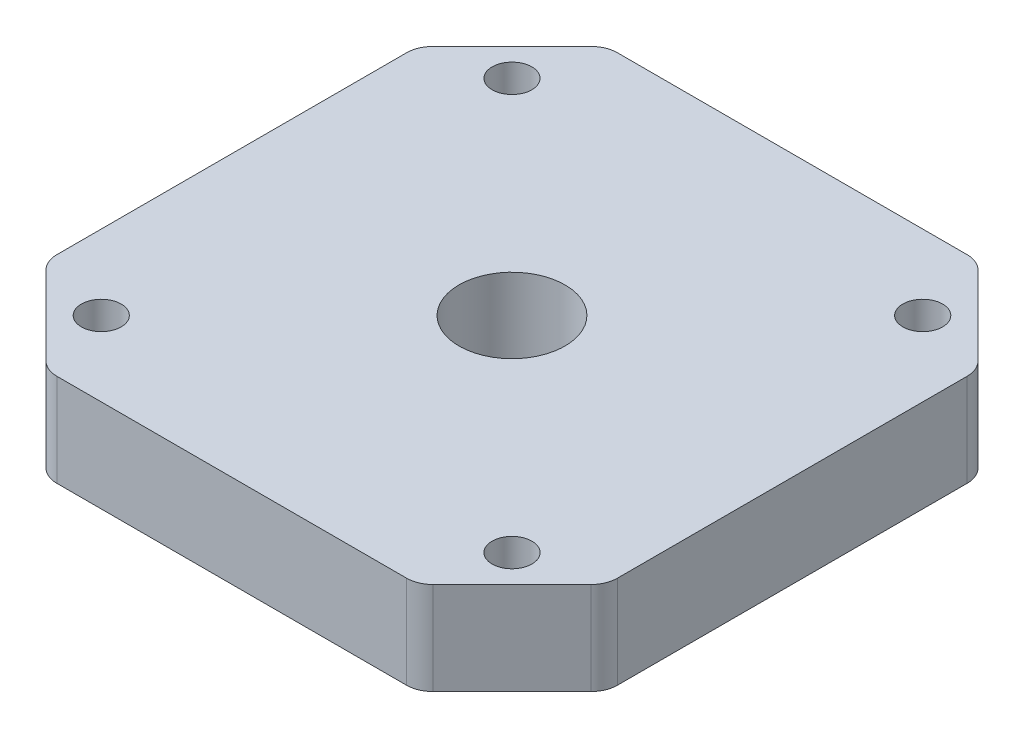
ISO-10303-21;
HEADER;
FILE_DESCRIPTION(('STEP AP214'),'2;1');
FILE_NAME('part.step','',(''),(''),'','','');
FILE_SCHEMA(('AUTOMOTIVE_DESIGN { 1 0 10303 214 1 1 1 1 }'));
ENDSEC;
DATA;
#1=APPLICATION_CONTEXT('core data for automotive mechanical design processes');
#2=APPLICATION_PROTOCOL_DEFINITION('international standard','automotive_design',2000,#1);
#3=PRODUCT_CONTEXT('',#1,'mechanical');
#4=PRODUCT('Part','Part','',(#3));
#5=PRODUCT_RELATED_PRODUCT_CATEGORY('part','',(#4));
#6=PRODUCT_DEFINITION_FORMATION('','',#4);
#7=PRODUCT_DEFINITION_CONTEXT('part definition',#1,'design');
#8=PRODUCT_DEFINITION('design','',#6,#7);
#9=PRODUCT_DEFINITION_SHAPE('','',#8);
#10=(LENGTH_UNIT() NAMED_UNIT(*) SI_UNIT(.MILLI.,.METRE.));
#11=(NAMED_UNIT(*) PLANE_ANGLE_UNIT() SI_UNIT($,.RADIAN.));
#12=(NAMED_UNIT(*) SI_UNIT($,.STERADIAN.) SOLID_ANGLE_UNIT());
#13=UNCERTAINTY_MEASURE_WITH_UNIT(LENGTH_MEASURE(1.E-05),#10,'distance_accuracy_value','');
#14=(GEOMETRIC_REPRESENTATION_CONTEXT(3) GLOBAL_UNCERTAINTY_ASSIGNED_CONTEXT((#13)) GLOBAL_UNIT_ASSIGNED_CONTEXT((#10,
#11,#12)) REPRESENTATION_CONTEXT('',''));
#15=CARTESIAN_POINT('',(0.,0.,0.));
#16=DIRECTION('',(0.,0.,1.));
#17=DIRECTION('',(1.,0.,0.));
#18=AXIS2_PLACEMENT_3D('',#15,#16,#17);
#19=CARTESIAN_POINT('',(21.,0.,-21.));
#20=DIRECTION('',(0.,1.,0.));
#21=DIRECTION('',(1.,0.,0.));
#22=AXIS2_PLACEMENT_3D('',#19,#20,#21);
#23=PLANE('',#22);
#24=CARTESIAN_POINT('',(36.5,0.,-36.5));
#25=DIRECTION('',(0.,-1.,0.));
#26=DIRECTION('',(1.,0.,0.));
#27=AXIS2_PLACEMENT_3D('',#24,#25,#26);
#28=CIRCLE('',#27,1.5);
#29=CARTESIAN_POINT('',(35.,0.,-36.5));
#30=VERTEX_POINT('',#29);
#31=EDGE_CURVE('E382',#30,#30,#28,.T.);
#32=ORIENTED_EDGE('',*,*,#31,.F.);
#33=EDGE_LOOP('',(#32));
#34=FACE_BOUND('',#33,.T.);
#35=CARTESIAN_POINT('',(36.5,0.,-5.5));
#36=DIRECTION('',(0.,-1.,0.));
#37=DIRECTION('',(1.,0.,0.));
#38=AXIS2_PLACEMENT_3D('',#35,#36,#37);
#39=CIRCLE('',#38,1.5);
#40=CARTESIAN_POINT('',(35.,0.,-5.5));
#41=VERTEX_POINT('',#40);
#42=EDGE_CURVE('E181',#41,#41,#39,.T.);
#43=ORIENTED_EDGE('',*,*,#42,.F.);
#44=EDGE_LOOP('',(#43));
#45=FACE_BOUND('',#44,.T.);
#46=CARTESIAN_POINT('',(5.5,0.,-5.5));
#47=DIRECTION('',(0.,-1.,0.));
#48=DIRECTION('',(1.,0.,0.));
#49=AXIS2_PLACEMENT_3D('',#46,#47,#48);
#50=CIRCLE('',#49,1.5);
#51=CARTESIAN_POINT('',(4.,0.,-5.5));
#52=VERTEX_POINT('',#51);
#53=EDGE_CURVE('E187',#52,#52,#50,.T.);
#54=ORIENTED_EDGE('',*,*,#53,.F.);
#55=EDGE_LOOP('',(#54));
#56=FACE_BOUND('',#55,.T.);
#57=CARTESIAN_POINT('',(21.,0.,-21.));
#58=DIRECTION('',(0.,-1.,0.));
#59=DIRECTION('',(1.,0.,0.));
#60=AXIS2_PLACEMENT_3D('',#57,#58,#59);
#61=CIRCLE('',#60,4.);
#62=CARTESIAN_POINT('',(17.,0.,-21.));
#63=VERTEX_POINT('',#62);
#64=EDGE_CURVE('E200',#63,#63,#61,.T.);
#65=ORIENTED_EDGE('',*,*,#64,.F.);
#66=EDGE_LOOP('',(#65));
#67=FACE_BOUND('',#66,.T.);
#68=CARTESIAN_POINT('',(5.5,0.,-36.5));
#69=DIRECTION('',(0.,-1.,0.));
#70=DIRECTION('',(1.,0.,0.));
#71=AXIS2_PLACEMENT_3D('',#68,#69,#70);
#72=CIRCLE('',#71,1.5);
#73=CARTESIAN_POINT('',(4.,0.,-36.5));
#74=VERTEX_POINT('',#73);
#75=EDGE_CURVE('E31',#74,#74,#72,.T.);
#76=ORIENTED_EDGE('',*,*,#75,.F.);
#77=EDGE_LOOP('',(#76));
#78=FACE_BOUND('',#77,.T.);
#79=CARTESIAN_POINT('',(7.80685424949238,0.,-1.85));
#80=DIRECTION('',(0.,1.,0.));
#81=DIRECTION('',(-0.38268343236509,0.,0.923879532511287));
#82=AXIS2_PLACEMENT_3D('',#79,#80,#81);
#83=CIRCLE('',#82,2.);
#84=CARTESIAN_POINT('',(6.39264068711929,0.,-0.435786437626905));
#85=VERTEX_POINT('',#84);
#86=CARTESIAN_POINT('',(7.80685424949238,0.,0.15));
#87=VERTEX_POINT('',#86);
#88=EDGE_CURVE('E349',#85,#87,#83,.T.);
#89=ORIENTED_EDGE('',*,*,#88,.F.);
#90=DIRECTION('',(0.707106781186547,0.,0.707106781186548));
#91=VECTOR('',#90,1.);
#92=CARTESIAN_POINT('',(-0.15,0.,-6.9784271247462));
#93=LINE('',#92,#91);
#94=CARTESIAN_POINT('',(0.435786437626905,0.,-6.39264068711929));
#95=VERTEX_POINT('',#94);
#96=EDGE_CURVE('E99',#95,#85,#93,.T.);
#97=ORIENTED_EDGE('',*,*,#96,.F.);
#98=CARTESIAN_POINT('',(1.85,0.,-7.80685424949239));
#99=DIRECTION('',(0.,1.,0.));
#100=DIRECTION('',(-0.923879532511287,0.,0.382683432365089));
#101=AXIS2_PLACEMENT_3D('',#98,#99,#100);
#102=CIRCLE('',#101,2.);
#103=CARTESIAN_POINT('',(-0.15,0.,-7.80685424949239));
#104=VERTEX_POINT('',#103);
#105=EDGE_CURVE('E272',#104,#95,#102,.T.);
#106=ORIENTED_EDGE('',*,*,#105,.F.);
#107=DIRECTION('',(0.,0.,1.));
#108=VECTOR('',#107,1.);
#109=CARTESIAN_POINT('',(-0.15,0.,-35.0215728752538));
#110=LINE('',#109,#108);
#111=CARTESIAN_POINT('',(-0.15,0.,-34.1931457505076));
#112=VERTEX_POINT('',#111);
#113=EDGE_CURVE('E255',#112,#104,#110,.T.);
#114=ORIENTED_EDGE('',*,*,#113,.F.);
#115=CARTESIAN_POINT('',(1.85,0.,-34.1931457505076));
#116=DIRECTION('',(0.,1.,0.));
#117=DIRECTION('',(-0.923879532511287,0.,-0.382683432365089));
#118=AXIS2_PLACEMENT_3D('',#115,#116,#117);
#119=CIRCLE('',#118,2.);
#120=CARTESIAN_POINT('',(0.435786437626905,0.,-35.6073593128807));
#121=VERTEX_POINT('',#120);
#122=EDGE_CURVE('E254',#121,#112,#119,.T.);
#123=ORIENTED_EDGE('',*,*,#122,.F.);
#124=DIRECTION('',(-0.707106781186547,0.,0.707106781186548));
#125=VECTOR('',#124,1.);
#126=CARTESIAN_POINT('',(6.97842712474618,0.,-42.15));
#127=LINE('',#126,#125);
#128=CARTESIAN_POINT('',(6.39264068711929,0.,-41.5642135623731));
#129=VERTEX_POINT('',#128);
#130=EDGE_CURVE('E376',#129,#121,#127,.T.);
#131=ORIENTED_EDGE('',*,*,#130,.F.);
#132=CARTESIAN_POINT('',(7.80685424949238,0.,-40.15));
#133=DIRECTION('',(0.,1.,0.));
#134=DIRECTION('',(-0.382683432365091,0.,-0.923879532511286));
#135=AXIS2_PLACEMENT_3D('',#132,#133,#134);
#136=CIRCLE('',#135,2.);
#137=CARTESIAN_POINT('',(7.80685424949238,0.,-42.15));
#138=VERTEX_POINT('',#137);
#139=EDGE_CURVE('E248',#138,#129,#136,.T.);
#140=ORIENTED_EDGE('',*,*,#139,.F.);
#141=DIRECTION('',(-1.,0.,0.));
#142=VECTOR('',#141,1.);
#143=CARTESIAN_POINT('',(35.0215728752538,0.,-42.15));
#144=LINE('',#143,#142);
#145=CARTESIAN_POINT('',(34.1931457505076,0.,-42.15));
#146=VERTEX_POINT('',#145);
#147=EDGE_CURVE('E236',#146,#138,#144,.T.);
#148=ORIENTED_EDGE('',*,*,#147,.F.);
#149=CARTESIAN_POINT('',(34.1931457505076,0.,-40.15));
#150=DIRECTION('',(0.,1.,0.));
#151=DIRECTION('',(0.382683432365088,0.,-0.923879532511287));
#152=AXIS2_PLACEMENT_3D('',#149,#150,#151);
#153=CIRCLE('',#152,2.);
#154=CARTESIAN_POINT('',(35.6073593128807,0.,-41.5642135623731));
#155=VERTEX_POINT('',#154);
#156=EDGE_CURVE('E241',#155,#146,#153,.T.);
#157=ORIENTED_EDGE('',*,*,#156,.F.);
#158=DIRECTION('',(-0.707106781186548,0.,-0.707106781186547));
#159=VECTOR('',#158,1.);
#160=CARTESIAN_POINT('',(42.15,0.,-35.0215728752538));
#161=LINE('',#160,#159);
#162=CARTESIAN_POINT('',(41.5642135623731,0.,-35.6073593128807));
#163=VERTEX_POINT('',#162);
#164=EDGE_CURVE('E285',#163,#155,#161,.T.);
#165=ORIENTED_EDGE('',*,*,#164,.F.);
#166=CARTESIAN_POINT('',(40.15,0.,-34.1931457505076));
#167=DIRECTION('',(0.,1.,0.));
#168=DIRECTION('',(0.923879532511287,0.,-0.38268343236509));
#169=AXIS2_PLACEMENT_3D('',#166,#167,#168);
#170=CIRCLE('',#169,2.);
#171=CARTESIAN_POINT('',(42.15,0.,-34.1931457505076));
#172=VERTEX_POINT('',#171);
#173=EDGE_CURVE('E227',#172,#163,#170,.T.);
#174=ORIENTED_EDGE('',*,*,#173,.F.);
#175=DIRECTION('',(0.,0.,-1.));
#176=VECTOR('',#175,1.);
#177=CARTESIAN_POINT('',(42.15,0.,-6.97842712474619));
#178=LINE('',#177,#176);
#179=CARTESIAN_POINT('',(42.15,0.,-7.80685424949238));
#180=VERTEX_POINT('',#179);
#181=EDGE_CURVE('E353',#180,#172,#178,.T.);
#182=ORIENTED_EDGE('',*,*,#181,.F.);
#183=CARTESIAN_POINT('',(40.15,0.,-7.80685424949238));
#184=DIRECTION('',(0.,1.,0.));
#185=DIRECTION('',(0.923879532511287,0.,0.382683432365089));
#186=AXIS2_PLACEMENT_3D('',#183,#184,#185);
#187=CIRCLE('',#186,2.);
#188=CARTESIAN_POINT('',(41.5642135623731,0.,-6.39264068711928));
#189=VERTEX_POINT('',#188);
#190=EDGE_CURVE('E680',#189,#180,#187,.T.);
#191=ORIENTED_EDGE('',*,*,#190,.F.);
#192=DIRECTION('',(-0.707106781186547,0.,0.707106781186548));
#193=VECTOR('',#192,1.);
#194=CARTESIAN_POINT('',(42.15,0.,-6.97842712474619));
#195=LINE('',#194,#193);
#196=CARTESIAN_POINT('',(35.6073593128807,0.,-0.435786437626901));
#197=VERTEX_POINT('',#196);
#198=EDGE_CURVE('E12',#189,#197,#195,.T.);
#199=ORIENTED_EDGE('',*,*,#198,.T.);
#200=CARTESIAN_POINT('',(34.1931457505076,0.,-1.85));
#201=DIRECTION('',(0.,1.,0.));
#202=DIRECTION('',(0.382683432365091,0.,0.923879532511286));
#203=AXIS2_PLACEMENT_3D('',#200,#201,#202);
#204=CIRCLE('',#203,2.);
#205=CARTESIAN_POINT('',(34.1931457505076,0.,0.150000000000004));
#206=VERTEX_POINT('',#205);
#207=EDGE_CURVE('E235',#206,#197,#204,.T.);
#208=ORIENTED_EDGE('',*,*,#207,.F.);
#209=DIRECTION('',(1.,0.,0.));
#210=VECTOR('',#209,1.);
#211=CARTESIAN_POINT('',(6.97842712474619,0.,0.15));
#212=LINE('',#211,#210);
#213=EDGE_CURVE('E82',#87,#206,#212,.T.);
#214=ORIENTED_EDGE('',*,*,#213,.F.);
#215=EDGE_LOOP('',(#89,#97,#106,#114,#123,#131,#140,#148,#157,#165,#174,#182,#191,#199,#208,#214));
#216=FACE_BOUND('',#215,.T.);
#217=ADVANCED_FACE('F20',(#34,#45,#56,#67,#78,#216),#23,.F.);
#218=CARTESIAN_POINT('',(35.0215728752538,0.,0.150000000000005));
#219=DIRECTION('',(0.707106781186548,0.,0.707106781186547));
#220=DIRECTION('',(0.,-1.,0.));
#221=AXIS2_PLACEMENT_3D('',#218,#219,#220);
#222=PLANE('',#221);
#223=DIRECTION('',(0.,1.,0.));
#224=VECTOR('',#223,1.);
#225=CARTESIAN_POINT('',(35.6073593128807,0.,-0.435786437626901));
#226=LINE('',#225,#224);
#227=CARTESIAN_POINT('',(35.6073593128807,7.,-0.435786437626901));
#228=VERTEX_POINT('',#227);
#229=EDGE_CURVE('E231',#197,#228,#226,.T.);
#230=ORIENTED_EDGE('',*,*,#229,.F.);
#231=ORIENTED_EDGE('',*,*,#198,.F.);
#232=DIRECTION('',(0.,-1.,0.));
#233=VECTOR('',#232,1.);
#234=CARTESIAN_POINT('',(41.5642135623731,0.,-6.39264068711928));
#235=LINE('',#234,#233);
#236=CARTESIAN_POINT('',(41.5642135623731,7.,-6.39264068711928));
#237=VERTEX_POINT('',#236);
#238=EDGE_CURVE('E686',#237,#189,#235,.T.);
#239=ORIENTED_EDGE('',*,*,#238,.F.);
#240=DIRECTION('',(0.707106781186547,0.,-0.707106781186548));
#241=VECTOR('',#240,1.);
#242=CARTESIAN_POINT('',(42.15,7.,-6.97842712474619));
#243=LINE('',#242,#241);
#244=EDGE_CURVE('E297',#228,#237,#243,.T.);
#245=ORIENTED_EDGE('',*,*,#244,.F.);
#246=EDGE_LOOP('',(#230,#231,#239,#245));
#247=FACE_BOUND('',#246,.T.);
#248=ADVANCED_FACE('F934',(#247),#222,.T.);
#249=CARTESIAN_POINT('',(5.5,0.,-36.5));
#250=DIRECTION('',(0.,1.,0.));
#251=DIRECTION('',(1.,0.,0.));
#252=AXIS2_PLACEMENT_3D('',#249,#250,#251);
#253=CYLINDRICAL_SURFACE('',#252,1.5);
#254=CARTESIAN_POINT('',(5.5,7.,-36.5));
#255=DIRECTION('',(0.,-1.,0.));
#256=DIRECTION('',(1.,0.,0.));
#257=AXIS2_PLACEMENT_3D('',#254,#255,#256);
#258=CIRCLE('',#257,1.5);
#259=CARTESIAN_POINT('',(4.,7.,-36.5));
#260=VERTEX_POINT('',#259);
#261=EDGE_CURVE('E323',#260,#260,#258,.T.);
#262=ORIENTED_EDGE('',*,*,#261,.F.);
#263=DIRECTION('',(0.,-1.,0.));
#264=VECTOR('',#263,1.);
#265=CARTESIAN_POINT('',(4.,0.,-36.5));
#266=LINE('',#265,#264);
#267=EDGE_CURVE('E224',#260,#74,#266,.T.);
#268=ORIENTED_EDGE('',*,*,#267,.T.);
#269=ORIENTED_EDGE('',*,*,#75,.T.);
#270=ORIENTED_EDGE('',*,*,#267,.F.);
#271=EDGE_LOOP('',(#262,#268,#269,#270));
#272=FACE_BOUND('',#271,.T.);
#273=ADVANCED_FACE('F925',(#272),#253,.F.);
#274=CARTESIAN_POINT('',(21.,0.,-21.));
#275=DIRECTION('',(0.,1.,0.));
#276=DIRECTION('',(1.,0.,0.));
#277=AXIS2_PLACEMENT_3D('',#274,#275,#276);
#278=CYLINDRICAL_SURFACE('',#277,4.);
#279=CARTESIAN_POINT('',(21.,7.,-21.));
#280=DIRECTION('',(0.,-1.,0.));
#281=DIRECTION('',(1.,0.,0.));
#282=AXIS2_PLACEMENT_3D('',#279,#280,#281);
#283=CIRCLE('',#282,4.);
#284=CARTESIAN_POINT('',(17.,7.,-21.));
#285=VERTEX_POINT('',#284);
#286=EDGE_CURVE('E328',#285,#285,#283,.T.);
#287=ORIENTED_EDGE('',*,*,#286,.F.);
#288=DIRECTION('',(0.,-1.,0.));
#289=VECTOR('',#288,1.);
#290=CARTESIAN_POINT('',(17.,0.,-21.));
#291=LINE('',#290,#289);
#292=EDGE_CURVE('E193',#285,#63,#291,.T.);
#293=ORIENTED_EDGE('',*,*,#292,.T.);
#294=ORIENTED_EDGE('',*,*,#64,.T.);
#295=ORIENTED_EDGE('',*,*,#292,.F.);
#296=EDGE_LOOP('',(#287,#293,#294,#295));
#297=FACE_BOUND('',#296,.T.);
#298=ADVANCED_FACE('F917',(#297),#278,.F.);
#299=CARTESIAN_POINT('',(5.5,0.,-5.5));
#300=DIRECTION('',(0.,1.,0.));
#301=DIRECTION('',(1.,0.,0.));
#302=AXIS2_PLACEMENT_3D('',#299,#300,#301);
#303=CYLINDRICAL_SURFACE('',#302,1.5);
#304=CARTESIAN_POINT('',(5.5,7.,-5.5));
#305=DIRECTION('',(0.,-1.,0.));
#306=DIRECTION('',(1.,0.,0.));
#307=AXIS2_PLACEMENT_3D('',#304,#305,#306);
#308=CIRCLE('',#307,1.5);
#309=CARTESIAN_POINT('',(4.,7.,-5.5));
#310=VERTEX_POINT('',#309);
#311=EDGE_CURVE('E330',#310,#310,#308,.T.);
#312=ORIENTED_EDGE('',*,*,#311,.F.);
#313=DIRECTION('',(0.,-1.,0.));
#314=VECTOR('',#313,1.);
#315=CARTESIAN_POINT('',(4.,0.,-5.5));
#316=LINE('',#315,#314);
#317=EDGE_CURVE('E24',#310,#52,#316,.T.);
#318=ORIENTED_EDGE('',*,*,#317,.T.);
#319=ORIENTED_EDGE('',*,*,#53,.T.);
#320=ORIENTED_EDGE('',*,*,#317,.F.);
#321=EDGE_LOOP('',(#312,#318,#319,#320));
#322=FACE_BOUND('',#321,.T.);
#323=ADVANCED_FACE('F189',(#322),#303,.F.);
#324=CARTESIAN_POINT('',(36.5,0.,-5.5));
#325=DIRECTION('',(0.,1.,0.));
#326=DIRECTION('',(1.,0.,0.));
#327=AXIS2_PLACEMENT_3D('',#324,#325,#326);
#328=CYLINDRICAL_SURFACE('',#327,1.5);
#329=CARTESIAN_POINT('',(36.5,7.,-5.5));
#330=DIRECTION('',(0.,-1.,0.));
#331=DIRECTION('',(1.,0.,0.));
#332=AXIS2_PLACEMENT_3D('',#329,#330,#331);
#333=CIRCLE('',#332,1.5);
#334=CARTESIAN_POINT('',(35.,7.,-5.5));
#335=VERTEX_POINT('',#334);
#336=EDGE_CURVE('E316',#335,#335,#333,.T.);
#337=ORIENTED_EDGE('',*,*,#336,.F.);
#338=DIRECTION('',(0.,-1.,0.));
#339=VECTOR('',#338,1.);
#340=CARTESIAN_POINT('',(35.,0.,-5.5));
#341=LINE('',#340,#339);
#342=EDGE_CURVE('E278',#335,#41,#341,.T.);
#343=ORIENTED_EDGE('',*,*,#342,.T.);
#344=ORIENTED_EDGE('',*,*,#42,.T.);
#345=ORIENTED_EDGE('',*,*,#342,.F.);
#346=EDGE_LOOP('',(#337,#343,#344,#345));
#347=FACE_BOUND('',#346,.T.);
#348=ADVANCED_FACE('F22',(#347),#328,.F.);
#349=CARTESIAN_POINT('',(36.5,0.,-36.5));
#350=DIRECTION('',(0.,1.,0.));
#351=DIRECTION('',(1.,0.,0.));
#352=AXIS2_PLACEMENT_3D('',#349,#350,#351);
#353=CYLINDRICAL_SURFACE('',#352,1.5);
#354=CARTESIAN_POINT('',(36.5,7.,-36.5));
#355=DIRECTION('',(0.,-1.,0.));
#356=DIRECTION('',(1.,0.,0.));
#357=AXIS2_PLACEMENT_3D('',#354,#355,#356);
#358=CIRCLE('',#357,1.5);
#359=CARTESIAN_POINT('',(35.,7.,-36.5));
#360=VERTEX_POINT('',#359);
#361=EDGE_CURVE('E273',#360,#360,#358,.T.);
#362=ORIENTED_EDGE('',*,*,#361,.F.);
#363=DIRECTION('',(0.,-1.,0.));
#364=VECTOR('',#363,1.);
#365=CARTESIAN_POINT('',(35.,0.,-36.5));
#366=LINE('',#365,#364);
#367=EDGE_CURVE('E225',#360,#30,#366,.T.);
#368=ORIENTED_EDGE('',*,*,#367,.T.);
#369=ORIENTED_EDGE('',*,*,#31,.T.);
#370=ORIENTED_EDGE('',*,*,#367,.F.);
#371=EDGE_LOOP('',(#362,#368,#369,#370));
#372=FACE_BOUND('',#371,.T.);
#373=ADVANCED_FACE('F894',(#372),#353,.F.);
#374=CARTESIAN_POINT('',(40.15,0.,-7.80685424949238));
#375=DIRECTION('',(0.,1.,0.));
#376=DIRECTION('',(0.923879532511287,0.,0.382683432365089));
#377=AXIS2_PLACEMENT_3D('',#374,#375,#376);
#378=CYLINDRICAL_SURFACE('',#377,2.);
#379=CARTESIAN_POINT('',(40.15,7.,-7.80685424949238));
#380=DIRECTION('',(0.,-1.,0.));
#381=DIRECTION('',(0.923879532511287,0.,0.382683432365089));
#382=AXIS2_PLACEMENT_3D('',#379,#380,#381);
#383=CIRCLE('',#382,2.);
#384=CARTESIAN_POINT('',(42.15,7.,-7.80685424949238));
#385=VERTEX_POINT('',#384);
#386=EDGE_CURVE('E291',#385,#237,#383,.T.);
#387=ORIENTED_EDGE('',*,*,#386,.T.);
#388=ORIENTED_EDGE('',*,*,#238,.T.);
#389=ORIENTED_EDGE('',*,*,#190,.T.);
#390=DIRECTION('',(0.,1.,0.));
#391=VECTOR('',#390,1.);
#392=CARTESIAN_POINT('',(42.15,0.,-7.80685424949238));
#393=LINE('',#392,#391);
#394=EDGE_CURVE('E229',#180,#385,#393,.T.);
#395=ORIENTED_EDGE('',*,*,#394,.T.);
#396=EDGE_LOOP('',(#387,#388,#389,#395));
#397=FACE_BOUND('',#396,.T.);
#398=ADVANCED_FACE('F884',(#397),#378,.T.);
#399=CARTESIAN_POINT('',(6.97842712474619,0.,0.15));
#400=DIRECTION('',(0.,0.,1.));
#401=DIRECTION('',(1.,0.,0.));
#402=AXIS2_PLACEMENT_3D('',#399,#400,#401);
#403=PLANE('',#402);
#404=DIRECTION('',(0.,1.,0.));
#405=VECTOR('',#404,1.);
#406=CARTESIAN_POINT('',(7.80685424949238,0.,0.15));
#407=LINE('',#406,#405);
#408=CARTESIAN_POINT('',(7.80685424949238,7.,0.15));
#409=VERTEX_POINT('',#408);
#410=EDGE_CURVE('E380',#87,#409,#407,.T.);
#411=ORIENTED_EDGE('',*,*,#410,.F.);
#412=ORIENTED_EDGE('',*,*,#213,.T.);
#413=DIRECTION('',(0.,-1.,0.));
#414=VECTOR('',#413,1.);
#415=CARTESIAN_POINT('',(34.1931457505076,0.,0.150000000000004));
#416=LINE('',#415,#414);
#417=CARTESIAN_POINT('',(34.1931457505076,7.,0.150000000000004));
#418=VERTEX_POINT('',#417);
#419=EDGE_CURVE('E256',#418,#206,#416,.T.);
#420=ORIENTED_EDGE('',*,*,#419,.F.);
#421=DIRECTION('',(1.,0.,0.));
#422=VECTOR('',#421,1.);
#423=CARTESIAN_POINT('',(6.97842712474619,7.,0.15));
#424=LINE('',#423,#422);
#425=EDGE_CURVE('E315',#409,#418,#424,.T.);
#426=ORIENTED_EDGE('',*,*,#425,.F.);
#427=EDGE_LOOP('',(#411,#412,#420,#426));
#428=FACE_BOUND('',#427,.T.);
#429=ADVANCED_FACE('F874',(#428),#403,.T.);
#430=CARTESIAN_POINT('',(34.1931457505076,0.,-1.85));
#431=DIRECTION('',(0.,1.,0.));
#432=DIRECTION('',(0.382683432365091,0.,0.923879532511286));
#433=AXIS2_PLACEMENT_3D('',#430,#431,#432);
#434=CYLINDRICAL_SURFACE('',#433,2.);
#435=CARTESIAN_POINT('',(34.1931457505076,7.,-1.85));
#436=DIRECTION('',(0.,-1.,0.));
#437=DIRECTION('',(0.382683432365091,0.,0.923879532511286));
#438=AXIS2_PLACEMENT_3D('',#435,#436,#437);
#439=CIRCLE('',#438,2.);
#440=EDGE_CURVE('E309',#228,#418,#439,.T.);
#441=ORIENTED_EDGE('',*,*,#440,.T.);
#442=ORIENTED_EDGE('',*,*,#419,.T.);
#443=ORIENTED_EDGE('',*,*,#207,.T.);
#444=ORIENTED_EDGE('',*,*,#229,.T.);
#445=EDGE_LOOP('',(#441,#442,#443,#444));
#446=FACE_BOUND('',#445,.T.);
#447=ADVANCED_FACE('F864',(#446),#434,.T.);
#448=CARTESIAN_POINT('',(42.15,0.,-6.97842712474619));
#449=DIRECTION('',(1.,0.,0.));
#450=DIRECTION('',(0.,1.,0.));
#451=AXIS2_PLACEMENT_3D('',#448,#449,#450);
#452=PLANE('',#451);
#453=DIRECTION('',(0.,-1.,0.));
#454=VECTOR('',#453,1.);
#455=CARTESIAN_POINT('',(42.15,0.,-34.1931457505076));
#456=LINE('',#455,#454);
#457=CARTESIAN_POINT('',(42.15,7.,-34.1931457505076));
#458=VERTEX_POINT('',#457);
#459=EDGE_CURVE('E230',#458,#172,#456,.T.);
#460=ORIENTED_EDGE('',*,*,#459,.F.);
#461=DIRECTION('',(0.,0.,-1.));
#462=VECTOR('',#461,1.);
#463=CARTESIAN_POINT('',(42.15,7.,-6.97842712474619));
#464=LINE('',#463,#462);
#465=EDGE_CURVE('E296',#385,#458,#464,.T.);
#466=ORIENTED_EDGE('',*,*,#465,.F.);
#467=ORIENTED_EDGE('',*,*,#394,.F.);
#468=ORIENTED_EDGE('',*,*,#181,.T.);
#469=EDGE_LOOP('',(#460,#466,#467,#468));
#470=FACE_BOUND('',#469,.T.);
#471=ADVANCED_FACE('F851',(#470),#452,.T.);
#472=CARTESIAN_POINT('',(40.15,0.,-34.1931457505076));
#473=DIRECTION('',(0.,1.,0.));
#474=DIRECTION('',(0.923879532511287,0.,-0.38268343236509));
#475=AXIS2_PLACEMENT_3D('',#472,#473,#474);
#476=CYLINDRICAL_SURFACE('',#475,2.);
#477=CARTESIAN_POINT('',(40.15,7.,-34.1931457505076));
#478=DIRECTION('',(0.,-1.,0.));
#479=DIRECTION('',(0.923879532511287,0.,-0.38268343236509));
#480=AXIS2_PLACEMENT_3D('',#477,#478,#479);
#481=CIRCLE('',#480,2.);
#482=CARTESIAN_POINT('',(41.5642135623731,7.,-35.6073593128807));
#483=VERTEX_POINT('',#482);
#484=EDGE_CURVE('E368',#483,#458,#481,.T.);
#485=ORIENTED_EDGE('',*,*,#484,.T.);
#486=ORIENTED_EDGE('',*,*,#459,.T.);
#487=ORIENTED_EDGE('',*,*,#173,.T.);
#488=DIRECTION('',(0.,1.,0.));
#489=VECTOR('',#488,1.);
#490=CARTESIAN_POINT('',(41.5642135623731,0.,-35.6073593128807));
#491=LINE('',#490,#489);
#492=EDGE_CURVE('E245',#163,#483,#491,.T.);
#493=ORIENTED_EDGE('',*,*,#492,.T.);
#494=EDGE_LOOP('',(#485,#486,#487,#493));
#495=FACE_BOUND('',#494,.T.);
#496=ADVANCED_FACE('F840',(#495),#476,.T.);
#497=CARTESIAN_POINT('',(42.15,0.,-35.0215728752538));
#498=DIRECTION('',(0.707106781186547,0.,-0.707106781186548));
#499=DIRECTION('',(0.,-1.,0.));
#500=AXIS2_PLACEMENT_3D('',#497,#498,#499);
#501=PLANE('',#500);
#502=DIRECTION('',(0.,-1.,0.));
#503=VECTOR('',#502,1.);
#504=CARTESIAN_POINT('',(35.6073593128807,0.,-41.5642135623731));
#505=LINE('',#504,#503);
#506=CARTESIAN_POINT('',(35.6073593128807,7.,-41.5642135623731));
#507=VERTEX_POINT('',#506);
#508=EDGE_CURVE('E239',#507,#155,#505,.T.);
#509=ORIENTED_EDGE('',*,*,#508,.F.);
#510=DIRECTION('',(-0.707106781186548,0.,-0.707106781186547));
#511=VECTOR('',#510,1.);
#512=CARTESIAN_POINT('',(42.15,7.,-35.0215728752538));
#513=LINE('',#512,#511);
#514=EDGE_CURVE('E274',#483,#507,#513,.T.);
#515=ORIENTED_EDGE('',*,*,#514,.F.);
#516=ORIENTED_EDGE('',*,*,#492,.F.);
#517=ORIENTED_EDGE('',*,*,#164,.T.);
#518=EDGE_LOOP('',(#509,#515,#516,#517));
#519=FACE_BOUND('',#518,.T.);
#520=ADVANCED_FACE('F829',(#519),#501,.T.);
#521=CARTESIAN_POINT('',(34.1931457505076,0.,-40.15));
#522=DIRECTION('',(0.,1.,0.));
#523=DIRECTION('',(0.382683432365088,0.,-0.923879532511287));
#524=AXIS2_PLACEMENT_3D('',#521,#522,#523);
#525=CYLINDRICAL_SURFACE('',#524,2.);
#526=CARTESIAN_POINT('',(34.1931457505076,7.,-40.15));
#527=DIRECTION('',(0.,-1.,0.));
#528=DIRECTION('',(0.382683432365088,0.,-0.923879532511287));
#529=AXIS2_PLACEMENT_3D('',#526,#527,#528);
#530=CIRCLE('',#529,2.);
#531=CARTESIAN_POINT('',(34.1931457505076,7.,-42.15));
#532=VERTEX_POINT('',#531);
#533=EDGE_CURVE('E364',#532,#507,#530,.T.);
#534=ORIENTED_EDGE('',*,*,#533,.T.);
#535=ORIENTED_EDGE('',*,*,#508,.T.);
#536=ORIENTED_EDGE('',*,*,#156,.T.);
#537=DIRECTION('',(0.,1.,0.));
#538=VECTOR('',#537,1.);
#539=CARTESIAN_POINT('',(34.1931457505076,0.,-42.15));
#540=LINE('',#539,#538);
#541=EDGE_CURVE('E240',#146,#532,#540,.T.);
#542=ORIENTED_EDGE('',*,*,#541,.T.);
#543=EDGE_LOOP('',(#534,#535,#536,#542));
#544=FACE_BOUND('',#543,.T.);
#545=ADVANCED_FACE('F819',(#544),#525,.T.);
#546=CARTESIAN_POINT('',(35.0215728752538,0.,-42.15));
#547=DIRECTION('',(0.,0.,-1.));
#548=DIRECTION('',(0.,-1.,0.));
#549=AXIS2_PLACEMENT_3D('',#546,#547,#548);
#550=PLANE('',#549);
#551=DIRECTION('',(0.,-1.,0.));
#552=VECTOR('',#551,1.);
#553=CARTESIAN_POINT('',(7.80685424949238,0.,-42.15));
#554=LINE('',#553,#552);
#555=CARTESIAN_POINT('',(7.80685424949238,7.,-42.15));
#556=VERTEX_POINT('',#555);
#557=EDGE_CURVE('E372',#556,#138,#554,.T.);
#558=ORIENTED_EDGE('',*,*,#557,.F.);
#559=DIRECTION('',(-1.,0.,0.));
#560=VECTOR('',#559,1.);
#561=CARTESIAN_POINT('',(35.0215728752538,7.,-42.15));
#562=LINE('',#561,#560);
#563=EDGE_CURVE('E359',#532,#556,#562,.T.);
#564=ORIENTED_EDGE('',*,*,#563,.F.);
#565=ORIENTED_EDGE('',*,*,#541,.F.);
#566=ORIENTED_EDGE('',*,*,#147,.T.);
#567=EDGE_LOOP('',(#558,#564,#565,#566));
#568=FACE_BOUND('',#567,.T.);
#569=ADVANCED_FACE('F811',(#568),#550,.T.);
#570=CARTESIAN_POINT('',(7.80685424949238,0.,-40.15));
#571=DIRECTION('',(0.,1.,0.));
#572=DIRECTION('',(-0.382683432365091,0.,-0.923879532511286));
#573=AXIS2_PLACEMENT_3D('',#570,#571,#572);
#574=CYLINDRICAL_SURFACE('',#573,2.);
#575=CARTESIAN_POINT('',(7.80685424949238,7.,-40.15));
#576=DIRECTION('',(0.,-1.,0.));
#577=DIRECTION('',(-0.382683432365091,0.,-0.923879532511286));
#578=AXIS2_PLACEMENT_3D('',#575,#576,#577);
#579=CIRCLE('',#578,2.);
#580=CARTESIAN_POINT('',(6.39264068711929,7.,-41.5642135623731));
#581=VERTEX_POINT('',#580);
#582=EDGE_CURVE('E363',#581,#556,#579,.T.);
#583=ORIENTED_EDGE('',*,*,#582,.T.);
#584=ORIENTED_EDGE('',*,*,#557,.T.);
#585=ORIENTED_EDGE('',*,*,#139,.T.);
#586=DIRECTION('',(0.,1.,0.));
#587=VECTOR('',#586,1.);
#588=CARTESIAN_POINT('',(6.39264068711929,0.,-41.5642135623731));
#589=LINE('',#588,#587);
#590=EDGE_CURVE('E352',#129,#581,#589,.T.);
#591=ORIENTED_EDGE('',*,*,#590,.T.);
#592=EDGE_LOOP('',(#583,#584,#585,#591));
#593=FACE_BOUND('',#592,.T.);
#594=ADVANCED_FACE('F419',(#593),#574,.T.);
#595=CARTESIAN_POINT('',(6.97842712474618,0.,-42.15));
#596=DIRECTION('',(-0.707106781186548,0.,-0.707106781186547));
#597=DIRECTION('',(-0.707106781186547,0.,0.707106781186548));
#598=AXIS2_PLACEMENT_3D('',#595,#596,#597);
#599=PLANE('',#598);
#600=DIRECTION('',(0.,-1.,0.));
#601=VECTOR('',#600,1.);
#602=CARTESIAN_POINT('',(0.435786437626905,0.,-35.6073593128807));
#603=LINE('',#602,#601);
#604=CARTESIAN_POINT('',(0.435786437626905,7.,-35.6073593128807));
#605=VERTEX_POINT('',#604);
#606=EDGE_CURVE('E249',#605,#121,#603,.T.);
#607=ORIENTED_EDGE('',*,*,#606,.F.);
#608=DIRECTION('',(-0.707106781186547,0.,0.707106781186548));
#609=VECTOR('',#608,1.);
#610=CARTESIAN_POINT('',(6.97842712474618,7.,-42.15));
#611=LINE('',#610,#609);
#612=EDGE_CURVE('E432',#581,#605,#611,.T.);
#613=ORIENTED_EDGE('',*,*,#612,.F.);
#614=ORIENTED_EDGE('',*,*,#590,.F.);
#615=ORIENTED_EDGE('',*,*,#130,.T.);
#616=EDGE_LOOP('',(#607,#613,#614,#615));
#617=FACE_BOUND('',#616,.T.);
#618=ADVANCED_FACE('F430',(#617),#599,.T.);
#619=CARTESIAN_POINT('',(1.85,0.,-34.1931457505076));
#620=DIRECTION('',(0.,1.,0.));
#621=DIRECTION('',(-0.923879532511287,0.,-0.382683432365089));
#622=AXIS2_PLACEMENT_3D('',#619,#620,#621);
#623=CYLINDRICAL_SURFACE('',#622,2.);
#624=CARTESIAN_POINT('',(1.85,7.,-34.1931457505076));
#625=DIRECTION('',(0.,-1.,0.));
#626=DIRECTION('',(-0.923879532511287,0.,-0.382683432365089));
#627=AXIS2_PLACEMENT_3D('',#624,#625,#626);
#628=CIRCLE('',#627,2.);
#629=CARTESIAN_POINT('',(-0.15,7.,-34.1931457505076));
#630=VERTEX_POINT('',#629);
#631=EDGE_CURVE('E205',#630,#605,#628,.T.);
#632=ORIENTED_EDGE('',*,*,#631,.T.);
#633=ORIENTED_EDGE('',*,*,#606,.T.);
#634=ORIENTED_EDGE('',*,*,#122,.T.);
#635=DIRECTION('',(0.,1.,0.));
#636=VECTOR('',#635,1.);
#637=CARTESIAN_POINT('',(-0.15,0.,-34.1931457505076));
#638=LINE('',#637,#636);
#639=EDGE_CURVE('E320',#112,#630,#638,.T.);
#640=ORIENTED_EDGE('',*,*,#639,.T.);
#641=EDGE_LOOP('',(#632,#633,#634,#640));
#642=FACE_BOUND('',#641,.T.);
#643=ADVANCED_FACE('F774',(#642),#623,.T.);
#644=CARTESIAN_POINT('',(-0.15,0.,-35.0215728752538));
#645=DIRECTION('',(-1.,0.,0.));
#646=DIRECTION('',(0.,0.,1.));
#647=AXIS2_PLACEMENT_3D('',#644,#645,#646);
#648=PLANE('',#647);
#649=DIRECTION('',(0.,-1.,0.));
#650=VECTOR('',#649,1.);
#651=CARTESIAN_POINT('',(-0.15,0.,-7.80685424949239));
#652=LINE('',#651,#650);
#653=CARTESIAN_POINT('',(-0.15,7.,-7.80685424949239));
#654=VERTEX_POINT('',#653);
#655=EDGE_CURVE('E267',#654,#104,#652,.T.);
#656=ORIENTED_EDGE('',*,*,#655,.F.);
#657=DIRECTION('',(0.,0.,1.));
#658=VECTOR('',#657,1.);
#659=CARTESIAN_POINT('',(-0.15,7.,-35.0215728752538));
#660=LINE('',#659,#658);
#661=EDGE_CURVE('E483',#630,#654,#660,.T.);
#662=ORIENTED_EDGE('',*,*,#661,.F.);
#663=ORIENTED_EDGE('',*,*,#639,.F.);
#664=ORIENTED_EDGE('',*,*,#113,.T.);
#665=EDGE_LOOP('',(#656,#662,#663,#664));
#666=FACE_BOUND('',#665,.T.);
#667=ADVANCED_FACE('F761',(#666),#648,.T.);
#668=CARTESIAN_POINT('',(1.85,0.,-7.80685424949239));
#669=DIRECTION('',(0.,1.,0.));
#670=DIRECTION('',(-0.923879532511287,0.,0.382683432365089));
#671=AXIS2_PLACEMENT_3D('',#668,#669,#670);
#672=CYLINDRICAL_SURFACE('',#671,2.);
#673=CARTESIAN_POINT('',(1.85,7.,-7.80685424949239));
#674=DIRECTION('',(0.,-1.,0.));
#675=DIRECTION('',(-0.923879532511287,0.,0.382683432365089));
#676=AXIS2_PLACEMENT_3D('',#673,#674,#675);
#677=CIRCLE('',#676,2.);
#678=CARTESIAN_POINT('',(0.435786437626905,7.,-6.39264068711929));
#679=VERTEX_POINT('',#678);
#680=EDGE_CURVE('E329',#679,#654,#677,.T.);
#681=ORIENTED_EDGE('',*,*,#680,.T.);
#682=ORIENTED_EDGE('',*,*,#655,.T.);
#683=ORIENTED_EDGE('',*,*,#105,.T.);
#684=DIRECTION('',(0.,1.,0.));
#685=VECTOR('',#684,1.);
#686=CARTESIAN_POINT('',(0.435786437626905,0.,-6.39264068711929));
#687=LINE('',#686,#685);
#688=EDGE_CURVE('E298',#95,#679,#687,.T.);
#689=ORIENTED_EDGE('',*,*,#688,.T.);
#690=EDGE_LOOP('',(#681,#682,#683,#689));
#691=FACE_BOUND('',#690,.T.);
#692=ADVANCED_FACE('F749',(#691),#672,.T.);
#693=CARTESIAN_POINT('',(21.,7.,-21.));
#694=DIRECTION('',(0.,1.,0.));
#695=DIRECTION('',(1.,0.,0.));
#696=AXIS2_PLACEMENT_3D('',#693,#694,#695);
#697=PLANE('',#696);
#698=ORIENTED_EDGE('',*,*,#361,.T.);
#699=EDGE_LOOP('',(#698));
#700=FACE_BOUND('',#699,.T.);
#701=ORIENTED_EDGE('',*,*,#336,.T.);
#702=EDGE_LOOP('',(#701));
#703=FACE_BOUND('',#702,.T.);
#704=ORIENTED_EDGE('',*,*,#311,.T.);
#705=EDGE_LOOP('',(#704));
#706=FACE_BOUND('',#705,.T.);
#707=ORIENTED_EDGE('',*,*,#286,.T.);
#708=EDGE_LOOP('',(#707));
#709=FACE_BOUND('',#708,.T.);
#710=ORIENTED_EDGE('',*,*,#261,.T.);
#711=EDGE_LOOP('',(#710));
#712=FACE_BOUND('',#711,.T.);
#713=CARTESIAN_POINT('',(7.80685424949238,7.,-1.85));
#714=DIRECTION('',(0.,-1.,0.));
#715=DIRECTION('',(-0.38268343236509,0.,0.923879532511287));
#716=AXIS2_PLACEMENT_3D('',#713,#714,#715);
#717=CIRCLE('',#716,2.);
#718=CARTESIAN_POINT('',(6.39264068711929,7.,-0.435786437626905));
#719=VERTEX_POINT('',#718);
#720=EDGE_CURVE('E279',#409,#719,#717,.T.);
#721=ORIENTED_EDGE('',*,*,#720,.F.);
#722=ORIENTED_EDGE('',*,*,#425,.T.);
#723=ORIENTED_EDGE('',*,*,#440,.F.);
#724=ORIENTED_EDGE('',*,*,#244,.T.);
#725=ORIENTED_EDGE('',*,*,#386,.F.);
#726=ORIENTED_EDGE('',*,*,#465,.T.);
#727=ORIENTED_EDGE('',*,*,#484,.F.);
#728=ORIENTED_EDGE('',*,*,#514,.T.);
#729=ORIENTED_EDGE('',*,*,#533,.F.);
#730=ORIENTED_EDGE('',*,*,#563,.T.);
#731=ORIENTED_EDGE('',*,*,#582,.F.);
#732=ORIENTED_EDGE('',*,*,#612,.T.);
#733=ORIENTED_EDGE('',*,*,#631,.F.);
#734=ORIENTED_EDGE('',*,*,#661,.T.);
#735=ORIENTED_EDGE('',*,*,#680,.F.);
#736=DIRECTION('',(0.707106781186547,0.,0.707106781186548));
#737=VECTOR('',#736,1.);
#738=CARTESIAN_POINT('',(-0.15,7.,-6.9784271247462));
#739=LINE('',#738,#737);
#740=EDGE_CURVE('E389',#679,#719,#739,.T.);
#741=ORIENTED_EDGE('',*,*,#740,.T.);
#742=EDGE_LOOP('',(#721,#722,#723,#724,#725,#726,#727,#728,#729,#730,#731,#732,#733,#734,#735,#741));
#743=FACE_BOUND('',#742,.T.);
#744=ADVANCED_FACE('F736',(#700,#703,#706,#709,#712,#743),#697,.T.);
#745=CARTESIAN_POINT('',(-0.15,0.,-6.9784271247462));
#746=DIRECTION('',(-0.707106781186548,0.,0.707106781186547));
#747=DIRECTION('',(0.,1.,0.));
#748=AXIS2_PLACEMENT_3D('',#745,#746,#747);
#749=PLANE('',#748);
#750=DIRECTION('',(0.,-1.,0.));
#751=VECTOR('',#750,1.);
#752=CARTESIAN_POINT('',(6.39264068711929,0.,-0.435786437626906));
#753=LINE('',#752,#751);
#754=EDGE_CURVE('E284',#719,#85,#753,.T.);
#755=ORIENTED_EDGE('',*,*,#754,.F.);
#756=ORIENTED_EDGE('',*,*,#740,.F.);
#757=ORIENTED_EDGE('',*,*,#688,.F.);
#758=ORIENTED_EDGE('',*,*,#96,.T.);
#759=EDGE_LOOP('',(#755,#756,#757,#758));
#760=FACE_BOUND('',#759,.T.);
#761=ADVANCED_FACE('F721',(#760),#749,.T.);
#762=CARTESIAN_POINT('',(7.80685424949238,0.,-1.85));
#763=DIRECTION('',(0.,1.,0.));
#764=DIRECTION('',(-0.38268343236509,0.,0.923879532511287));
#765=AXIS2_PLACEMENT_3D('',#762,#763,#764);
#766=CYLINDRICAL_SURFACE('',#765,2.);
#767=ORIENTED_EDGE('',*,*,#720,.T.);
#768=ORIENTED_EDGE('',*,*,#754,.T.);
#769=ORIENTED_EDGE('',*,*,#88,.T.);
#770=ORIENTED_EDGE('',*,*,#410,.T.);
#771=EDGE_LOOP('',(#767,#768,#769,#770));
#772=FACE_BOUND('',#771,.T.);
#773=ADVANCED_FACE('F706',(#772),#766,.T.);
#774=CLOSED_SHELL('',(#217,#248,#273,#298,#323,#348,#373,#398,#429,#447,#471,#496,#520,#545,
#569,#594,#618,#643,#667,#692,#744,#761,#773));
#775=MANIFOLD_SOLID_BREP('B1',#774);
#776=ADVANCED_BREP_SHAPE_REPRESENTATION('',(#18,#775),#14);
#777=SHAPE_DEFINITION_REPRESENTATION(#9,#776);
ENDSEC;
END-ISO-10303-21;
